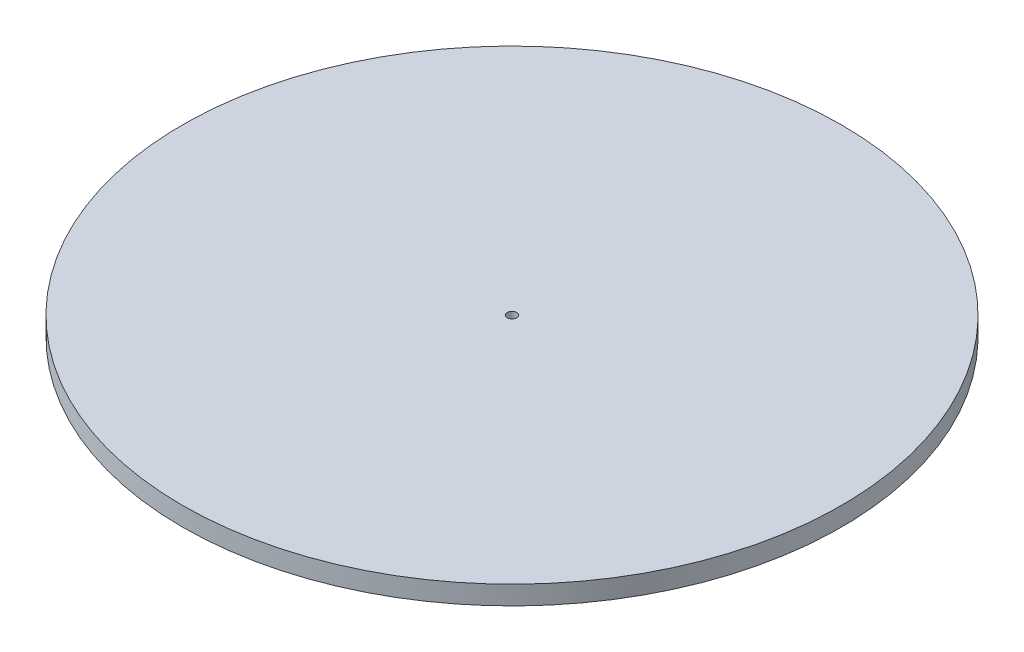
ISO-10303-21;
HEADER;
FILE_DESCRIPTION(('STEP AP214'),'2;1');
FILE_NAME('part.step','',(''),(''),'','','');
FILE_SCHEMA(('AUTOMOTIVE_DESIGN { 1 0 10303 214 1 1 1 1 }'));
ENDSEC;
DATA;
#1=APPLICATION_CONTEXT('core data for automotive mechanical design processes');
#2=APPLICATION_PROTOCOL_DEFINITION('international standard','automotive_design',2000,#1);
#3=PRODUCT_CONTEXT('',#1,'mechanical');
#4=PRODUCT('Part','Part','',(#3));
#5=PRODUCT_RELATED_PRODUCT_CATEGORY('part','',(#4));
#6=PRODUCT_DEFINITION_FORMATION('','',#4);
#7=PRODUCT_DEFINITION_CONTEXT('part definition',#1,'design');
#8=PRODUCT_DEFINITION('design','',#6,#7);
#9=PRODUCT_DEFINITION_SHAPE('','',#8);
#10=(LENGTH_UNIT() NAMED_UNIT(*) SI_UNIT(.MILLI.,.METRE.));
#11=(NAMED_UNIT(*) PLANE_ANGLE_UNIT() SI_UNIT($,.RADIAN.));
#12=(NAMED_UNIT(*) SI_UNIT($,.STERADIAN.) SOLID_ANGLE_UNIT());
#13=UNCERTAINTY_MEASURE_WITH_UNIT(LENGTH_MEASURE(1.E-05),#10,'distance_accuracy_value','');
#14=(GEOMETRIC_REPRESENTATION_CONTEXT(3) GLOBAL_UNCERTAINTY_ASSIGNED_CONTEXT((#13)) GLOBAL_UNIT_ASSIGNED_CONTEXT((#10,
#11,#12)) REPRESENTATION_CONTEXT('',''));
#15=CARTESIAN_POINT('',(0.,0.,0.));
#16=DIRECTION('',(0.,0.,1.));
#17=DIRECTION('',(1.,0.,0.));
#18=AXIS2_PLACEMENT_3D('',#15,#16,#17);
#19=CARTESIAN_POINT('',(0.,50.,0.));
#20=DIRECTION('',(0.,-1.,0.));
#21=DIRECTION('',(0.,0.,-1.));
#22=AXIS2_PLACEMENT_3D('',#19,#20,#21);
#23=CYLINDRICAL_SURFACE('',#22,875.);
#24=CARTESIAN_POINT('',(0.,50.,0.));
#25=DIRECTION('',(0.,1.,0.));
#26=DIRECTION('',(0.,0.,1.));
#27=AXIS2_PLACEMENT_3D('',#24,#25,#26);
#28=CIRCLE('',#27,875.);
#29=CARTESIAN_POINT('',(0.,50.,875.));
#30=VERTEX_POINT('',#29);
#31=EDGE_CURVE('E10',#30,#30,#28,.T.);
#32=ORIENTED_EDGE('',*,*,#31,.F.);
#33=EDGE_LOOP('',(#32));
#34=FACE_BOUND('',#33,.T.);
#35=CARTESIAN_POINT('',(0.,0.,0.));
#36=DIRECTION('',(0.,1.,0.));
#37=DIRECTION('',(0.,0.,1.));
#38=AXIS2_PLACEMENT_3D('',#35,#36,#37);
#39=CIRCLE('',#38,875.);
#40=CARTESIAN_POINT('',(0.,0.,875.));
#41=VERTEX_POINT('',#40);
#42=EDGE_CURVE('E41',#41,#41,#39,.T.);
#43=ORIENTED_EDGE('',*,*,#42,.T.);
#44=EDGE_LOOP('',(#43));
#45=FACE_BOUND('',#44,.T.);
#46=ADVANCED_FACE('F38',(#34,#45),#23,.T.);
#47=CARTESIAN_POINT('',(0.,50.,0.));
#48=DIRECTION('',(0.,1.,0.));
#49=DIRECTION('',(0.,0.,1.));
#50=AXIS2_PLACEMENT_3D('',#47,#48,#49);
#51=PLANE('',#50);
#52=CARTESIAN_POINT('',(0.,50.,0.));
#53=DIRECTION('',(0.,1.,0.));
#54=DIRECTION('',(0.,0.,1.));
#55=AXIS2_PLACEMENT_3D('',#52,#53,#54);
#56=CIRCLE('',#55,12.5);
#57=CARTESIAN_POINT('',(0.,50.,12.5));
#58=VERTEX_POINT('',#57);
#59=EDGE_CURVE('E50',#58,#58,#56,.T.);
#60=ORIENTED_EDGE('',*,*,#59,.F.);
#61=EDGE_LOOP('',(#60));
#62=FACE_BOUND('',#61,.T.);
#63=ORIENTED_EDGE('',*,*,#31,.T.);
#64=EDGE_LOOP('',(#63));
#65=FACE_BOUND('',#64,.T.);
#66=ADVANCED_FACE('F65',(#62,#65),#51,.T.);
#67=CARTESIAN_POINT('',(0.,0.,0.));
#68=DIRECTION('',(0.,1.,0.));
#69=DIRECTION('',(0.,0.,1.));
#70=AXIS2_PLACEMENT_3D('',#67,#68,#69);
#71=PLANE('',#70);
#72=CARTESIAN_POINT('',(0.,0.,0.));
#73=DIRECTION('',(0.,1.,0.));
#74=DIRECTION('',(0.,0.,1.));
#75=AXIS2_PLACEMENT_3D('',#72,#73,#74);
#76=CIRCLE('',#75,12.5);
#77=CARTESIAN_POINT('',(0.,0.,12.5));
#78=VERTEX_POINT('',#77);
#79=EDGE_CURVE('E48',#78,#78,#76,.T.);
#80=ORIENTED_EDGE('',*,*,#79,.T.);
#81=EDGE_LOOP('',(#80));
#82=FACE_BOUND('',#81,.T.);
#83=ORIENTED_EDGE('',*,*,#42,.F.);
#84=EDGE_LOOP('',(#83));
#85=FACE_BOUND('',#84,.T.);
#86=ADVANCED_FACE('F56',(#82,#85),#71,.F.);
#87=CARTESIAN_POINT('',(0.,0.,0.));
#88=DIRECTION('',(0.,1.,0.));
#89=DIRECTION('',(0.,0.,1.));
#90=AXIS2_PLACEMENT_3D('',#87,#88,#89);
#91=CYLINDRICAL_SURFACE('',#90,12.5);
#92=ORIENTED_EDGE('',*,*,#79,.F.);
#93=EDGE_LOOP('',(#92));
#94=FACE_BOUND('',#93,.T.);
#95=ORIENTED_EDGE('',*,*,#59,.T.);
#96=EDGE_LOOP('',(#95));
#97=FACE_BOUND('',#96,.T.);
#98=ADVANCED_FACE('F59',(#94,#97),#91,.F.);
#99=CLOSED_SHELL('',(#46,#66,#86,#98));
#100=MANIFOLD_SOLID_BREP('B2',#99);
#101=ADVANCED_BREP_SHAPE_REPRESENTATION('',(#18,#100),#14);
#102=SHAPE_DEFINITION_REPRESENTATION(#9,#101);
ENDSEC;
END-ISO-10303-21;
